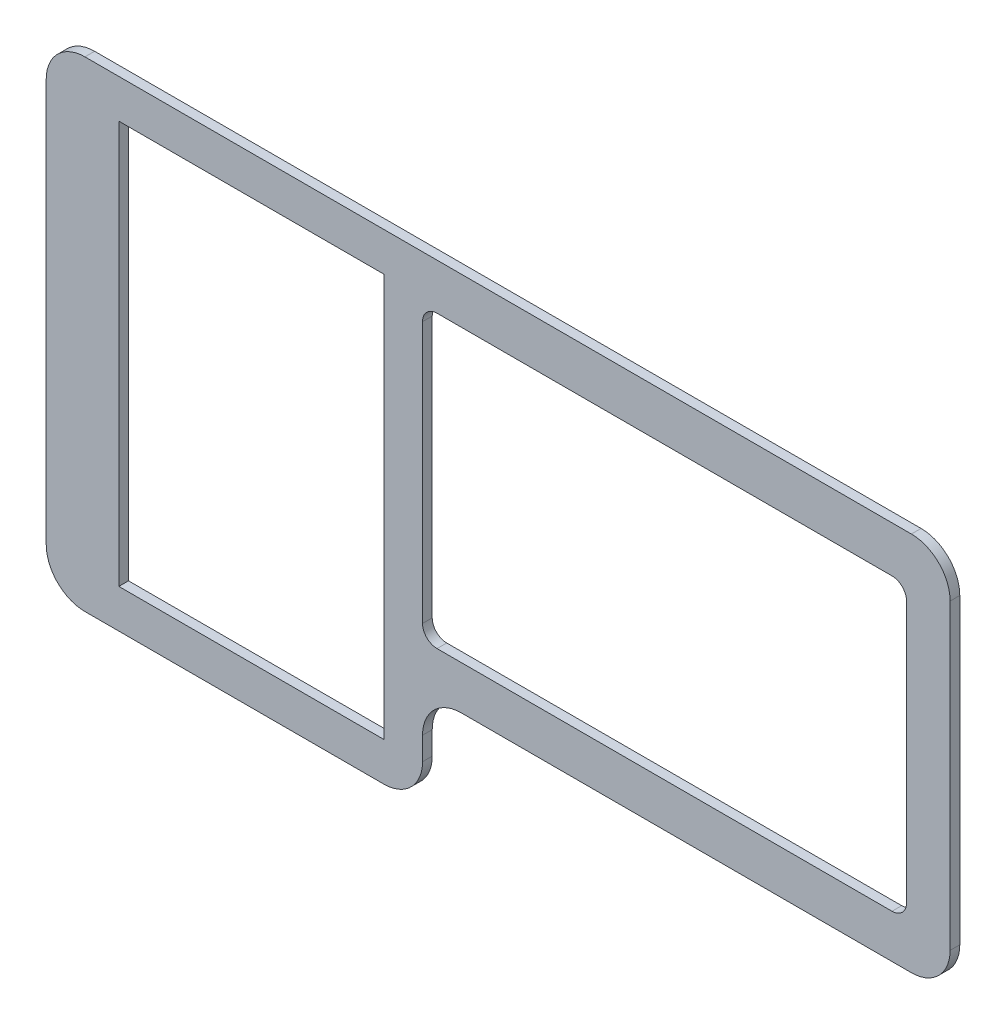
ISO-10303-21;
HEADER;
FILE_DESCRIPTION(('STEP AP214'),'2;1');
FILE_NAME('part.step','',(''),(''),'','','');
FILE_SCHEMA(('AUTOMOTIVE_DESIGN { 1 0 10303 214 1 1 1 1 }'));
ENDSEC;
DATA;
#1=APPLICATION_CONTEXT('core data for automotive mechanical design processes');
#2=APPLICATION_PROTOCOL_DEFINITION('international standard','automotive_design',2000,#1);
#3=PRODUCT_CONTEXT('',#1,'mechanical');
#4=PRODUCT('Part','Part','',(#3));
#5=PRODUCT_RELATED_PRODUCT_CATEGORY('part','',(#4));
#6=PRODUCT_DEFINITION_FORMATION('','',#4);
#7=PRODUCT_DEFINITION_CONTEXT('part definition',#1,'design');
#8=PRODUCT_DEFINITION('design','',#6,#7);
#9=PRODUCT_DEFINITION_SHAPE('','',#8);
#10=(LENGTH_UNIT() NAMED_UNIT(*) SI_UNIT(.MILLI.,.METRE.));
#11=(NAMED_UNIT(*) PLANE_ANGLE_UNIT() SI_UNIT($,.RADIAN.));
#12=(NAMED_UNIT(*) SI_UNIT($,.STERADIAN.) SOLID_ANGLE_UNIT());
#13=UNCERTAINTY_MEASURE_WITH_UNIT(LENGTH_MEASURE(1.E-05),#10,'distance_accuracy_value','');
#14=(GEOMETRIC_REPRESENTATION_CONTEXT(3) GLOBAL_UNCERTAINTY_ASSIGNED_CONTEXT((#13)) GLOBAL_UNIT_ASSIGNED_CONTEXT((#10,
#11,#12)) REPRESENTATION_CONTEXT('',''));
#15=CARTESIAN_POINT('',(0.,0.,0.));
#16=DIRECTION('',(0.,0.,1.));
#17=DIRECTION('',(1.,0.,0.));
#18=AXIS2_PLACEMENT_3D('',#15,#16,#17);
#19=CARTESIAN_POINT('',(51.,-31.,2.));
#20=DIRECTION('',(0.,0.,1.));
#21=DIRECTION('',(1.,0.,0.));
#22=AXIS2_PLACEMENT_3D('',#19,#20,#21);
#23=PLANE('',#22);
#24=CARTESIAN_POINT('',(51.,-31.,2.));
#25=DIRECTION('',(0.,0.,1.));
#26=DIRECTION('',(1.,0.,0.));
#27=AXIS2_PLACEMENT_3D('',#24,#25,#26);
#28=CIRCLE('',#27,8.);
#29=CARTESIAN_POINT('',(51.,-39.,2.));
#30=VERTEX_POINT('',#29);
#31=CARTESIAN_POINT('',(59.,-30.9999999999999,2.));
#32=VERTEX_POINT('',#31);
#33=EDGE_CURVE('E333',#30,#32,#28,.T.);
#34=ORIENTED_EDGE('',*,*,#33,.T.);
#35=DIRECTION('',(0.,1.,0.));
#36=VECTOR('',#35,1.);
#37=CARTESIAN_POINT('',(59.,31.5,2.));
#38=LINE('',#37,#36);
#39=CARTESIAN_POINT('',(59.,31.5,2.));
#40=VERTEX_POINT('',#39);
#41=EDGE_CURVE('E337',#32,#40,#38,.T.);
#42=ORIENTED_EDGE('',*,*,#41,.T.);
#43=CARTESIAN_POINT('',(51.,31.5,2.));
#44=DIRECTION('',(0.,0.,1.));
#45=DIRECTION('',(-1.,0.,0.));
#46=AXIS2_PLACEMENT_3D('',#43,#44,#45);
#47=CIRCLE('',#46,7.99999999999999);
#48=CARTESIAN_POINT('',(51.,39.5,2.));
#49=VERTEX_POINT('',#48);
#50=EDGE_CURVE('E341',#40,#49,#47,.T.);
#51=ORIENTED_EDGE('',*,*,#50,.T.);
#52=DIRECTION('',(-1.,0.,0.));
#53=VECTOR('',#52,1.);
#54=CARTESIAN_POINT('',(-119.75,39.5,2.));
#55=LINE('',#54,#53);
#56=CARTESIAN_POINT('',(-119.75,39.5,2.));
#57=VERTEX_POINT('',#56);
#58=EDGE_CURVE('E344',#49,#57,#55,.T.);
#59=ORIENTED_EDGE('',*,*,#58,.T.);
#60=CARTESIAN_POINT('',(-119.75,31.5,2.));
#61=DIRECTION('',(0.,0.,1.));
#62=DIRECTION('',(1.,0.,0.));
#63=AXIS2_PLACEMENT_3D('',#60,#61,#62);
#64=CIRCLE('',#63,8.);
#65=CARTESIAN_POINT('',(-127.75,31.5,2.));
#66=VERTEX_POINT('',#65);
#67=EDGE_CURVE('E347',#57,#66,#64,.T.);
#68=ORIENTED_EDGE('',*,*,#67,.T.);
#69=DIRECTION('',(0.,-1.,0.));
#70=VECTOR('',#69,1.);
#71=CARTESIAN_POINT('',(-127.75,31.5,2.));
#72=LINE('',#71,#70);
#73=CARTESIAN_POINT('',(-127.75,-51.75,2.));
#74=VERTEX_POINT('',#73);
#75=EDGE_CURVE('E350',#66,#74,#72,.T.);
#76=ORIENTED_EDGE('',*,*,#75,.T.);
#77=CARTESIAN_POINT('',(-119.75,-51.75,2.));
#78=DIRECTION('',(0.,0.,1.));
#79=DIRECTION('',(1.,0.,0.));
#80=AXIS2_PLACEMENT_3D('',#77,#78,#79);
#81=CIRCLE('',#80,8.00000000000001);
#82=CARTESIAN_POINT('',(-119.75,-59.75,2.));
#83=VERTEX_POINT('',#82);
#84=EDGE_CURVE('E353',#74,#83,#81,.T.);
#85=ORIENTED_EDGE('',*,*,#84,.T.);
#86=DIRECTION('',(1.,0.,0.));
#87=VECTOR('',#86,1.);
#88=CARTESIAN_POINT('',(-119.75,-59.75,2.));
#89=LINE('',#88,#87);
#90=CARTESIAN_POINT('',(-58.,-59.75,2.));
#91=VERTEX_POINT('',#90);
#92=EDGE_CURVE('E356',#83,#91,#89,.T.);
#93=ORIENTED_EDGE('',*,*,#92,.T.);
#94=CARTESIAN_POINT('',(-58.,-51.75,2.));
#95=DIRECTION('',(0.,0.,1.));
#96=DIRECTION('',(-1.,0.,0.));
#97=AXIS2_PLACEMENT_3D('',#94,#95,#96);
#98=CIRCLE('',#97,8.);
#99=CARTESIAN_POINT('',(-50.,-51.75,2.));
#100=VERTEX_POINT('',#99);
#101=EDGE_CURVE('E359',#91,#100,#98,.T.);
#102=ORIENTED_EDGE('',*,*,#101,.T.);
#103=DIRECTION('',(0.,1.,0.));
#104=VECTOR('',#103,1.);
#105=CARTESIAN_POINT('',(-50.,-51.75,2.));
#106=LINE('',#105,#104);
#107=CARTESIAN_POINT('',(-50.,-47.0000000000001,2.));
#108=VERTEX_POINT('',#107);
#109=EDGE_CURVE('E362',#100,#108,#106,.T.);
#110=ORIENTED_EDGE('',*,*,#109,.T.);
#111=CARTESIAN_POINT('',(-42.,-47.,2.));
#112=DIRECTION('',(0.,0.,-1.));
#113=DIRECTION('',(-1.,0.,0.));
#114=AXIS2_PLACEMENT_3D('',#111,#112,#113);
#115=CIRCLE('',#114,8.);
#116=CARTESIAN_POINT('',(-41.9999999999999,-39.,2.));
#117=VERTEX_POINT('',#116);
#118=EDGE_CURVE('E365',#108,#117,#115,.T.);
#119=ORIENTED_EDGE('',*,*,#118,.T.);
#120=DIRECTION('',(1.,0.,0.));
#121=VECTOR('',#120,1.);
#122=CARTESIAN_POINT('',(-41.9999999999999,-39.,2.));
#123=LINE('',#122,#121);
#124=EDGE_CURVE('E368',#117,#30,#123,.T.);
#125=ORIENTED_EDGE('',*,*,#124,.T.);
#126=EDGE_LOOP('',(#34,#42,#51,#59,#68,#76,#85,#93,#102,#110,#119,#125));
#127=FACE_BOUND('',#126,.T.);
#128=DIRECTION('',(1.,0.,0.));
#129=VECTOR('',#128,1.);
#130=CARTESIAN_POINT('',(-112.75,-51.75,2.));
#131=LINE('',#130,#129);
#132=CARTESIAN_POINT('',(-112.75,-51.75,2.));
#133=VERTEX_POINT('',#132);
#134=CARTESIAN_POINT('',(-58.,-51.75,2.));
#135=VERTEX_POINT('',#134);
#136=EDGE_CURVE('E293',#133,#135,#131,.T.);
#137=ORIENTED_EDGE('',*,*,#136,.F.);
#138=DIRECTION('',(0.,-1.,0.));
#139=VECTOR('',#138,1.);
#140=CARTESIAN_POINT('',(-112.75,31.5,2.));
#141=LINE('',#140,#139);
#142=CARTESIAN_POINT('',(-112.75,31.5,2.));
#143=VERTEX_POINT('',#142);
#144=EDGE_CURVE('E290',#143,#133,#141,.T.);
#145=ORIENTED_EDGE('',*,*,#144,.F.);
#146=DIRECTION('',(-1.,0.,0.));
#147=VECTOR('',#146,1.);
#148=CARTESIAN_POINT('',(-112.75,31.5,2.));
#149=LINE('',#148,#147);
#150=CARTESIAN_POINT('',(-58.,31.5,2.));
#151=VERTEX_POINT('',#150);
#152=EDGE_CURVE('E301',#151,#143,#149,.T.);
#153=ORIENTED_EDGE('',*,*,#152,.F.);
#154=DIRECTION('',(0.,1.,0.));
#155=VECTOR('',#154,1.);
#156=CARTESIAN_POINT('',(-58.,31.5,2.));
#157=LINE('',#156,#155);
#158=EDGE_CURVE('E297',#135,#151,#157,.T.);
#159=ORIENTED_EDGE('',*,*,#158,.F.);
#160=EDGE_LOOP('',(#137,#145,#153,#159));
#161=FACE_BOUND('',#160,.T.);
#162=DIRECTION('',(-1.,0.,0.));
#163=VECTOR('',#162,1.);
#164=CARTESIAN_POINT('',(-47.,30.,2.));
#165=LINE('',#164,#163);
#166=CARTESIAN_POINT('',(47.,30.,2.));
#167=VERTEX_POINT('',#166);
#168=CARTESIAN_POINT('',(-47.,30.,2.));
#169=VERTEX_POINT('',#168);
#170=EDGE_CURVE('E210',#167,#169,#165,.T.);
#171=ORIENTED_EDGE('',*,*,#170,.F.);
#172=CARTESIAN_POINT('',(47.,27.,2.));
#173=DIRECTION('',(0.,0.,1.));
#174=DIRECTION('',(-1.,0.,0.));
#175=AXIS2_PLACEMENT_3D('',#172,#173,#174);
#176=CIRCLE('',#175,3.);
#177=CARTESIAN_POINT('',(50.,27.,2.));
#178=VERTEX_POINT('',#177);
#179=EDGE_CURVE('E201',#178,#167,#176,.T.);
#180=ORIENTED_EDGE('',*,*,#179,.F.);
#181=DIRECTION('',(0.,1.,0.));
#182=VECTOR('',#181,1.);
#183=CARTESIAN_POINT('',(50.,27.,2.));
#184=LINE('',#183,#182);
#185=CARTESIAN_POINT('',(50.,-27.,2.));
#186=VERTEX_POINT('',#185);
#187=EDGE_CURVE('E242',#186,#178,#184,.T.);
#188=ORIENTED_EDGE('',*,*,#187,.F.);
#189=CARTESIAN_POINT('',(47.,-27.,2.));
#190=DIRECTION('',(0.,0.,1.));
#191=DIRECTION('',(1.,0.,0.));
#192=AXIS2_PLACEMENT_3D('',#189,#190,#191);
#193=CIRCLE('',#192,3.);
#194=CARTESIAN_POINT('',(47.,-30.,2.));
#195=VERTEX_POINT('',#194);
#196=EDGE_CURVE('E239',#195,#186,#193,.T.);
#197=ORIENTED_EDGE('',*,*,#196,.F.);
#198=DIRECTION('',(1.,0.,0.));
#199=VECTOR('',#198,1.);
#200=CARTESIAN_POINT('',(-47.,-30.,2.));
#201=LINE('',#200,#199);
#202=CARTESIAN_POINT('',(-47.,-30.,2.));
#203=VERTEX_POINT('',#202);
#204=EDGE_CURVE('E236',#203,#195,#201,.T.);
#205=ORIENTED_EDGE('',*,*,#204,.F.);
#206=CARTESIAN_POINT('',(-47.,-27.,2.));
#207=DIRECTION('',(0.,0.,1.));
#208=DIRECTION('',(1.,0.,0.));
#209=AXIS2_PLACEMENT_3D('',#206,#207,#208);
#210=CIRCLE('',#209,3.);
#211=CARTESIAN_POINT('',(-50.,-27.,2.));
#212=VERTEX_POINT('',#211);
#213=EDGE_CURVE('E233',#212,#203,#210,.T.);
#214=ORIENTED_EDGE('',*,*,#213,.F.);
#215=DIRECTION('',(0.,-1.,0.));
#216=VECTOR('',#215,1.);
#217=CARTESIAN_POINT('',(-50.,27.,2.));
#218=LINE('',#217,#216);
#219=CARTESIAN_POINT('',(-50.,27.,2.));
#220=VERTEX_POINT('',#219);
#221=EDGE_CURVE('E228',#220,#212,#218,.T.);
#222=ORIENTED_EDGE('',*,*,#221,.F.);
#223=CARTESIAN_POINT('',(-47.,27.,2.));
#224=DIRECTION('',(0.,0.,1.));
#225=DIRECTION('',(1.,0.,0.));
#226=AXIS2_PLACEMENT_3D('',#223,#224,#225);
#227=CIRCLE('',#226,3.);
#228=EDGE_CURVE('E224',#169,#220,#227,.T.);
#229=ORIENTED_EDGE('',*,*,#228,.F.);
#230=EDGE_LOOP('',(#171,#180,#188,#197,#205,#214,#222,#229));
#231=FACE_BOUND('',#230,.T.);
#232=ADVANCED_FACE('F39',(#127,#161,#231),#23,.T.);
#233=CARTESIAN_POINT('',(51.,-31.,0.));
#234=DIRECTION('',(0.,0.,1.));
#235=DIRECTION('',(1.,0.,0.));
#236=AXIS2_PLACEMENT_3D('',#233,#234,#235);
#237=PLANE('',#236);
#238=DIRECTION('',(0.,-1.,0.));
#239=VECTOR('',#238,1.);
#240=CARTESIAN_POINT('',(-112.75,31.5,0.));
#241=LINE('',#240,#239);
#242=CARTESIAN_POINT('',(-112.75,31.5,0.));
#243=VERTEX_POINT('',#242);
#244=CARTESIAN_POINT('',(-112.75,-51.75,0.));
#245=VERTEX_POINT('',#244);
#246=EDGE_CURVE('E219',#243,#245,#241,.T.);
#247=ORIENTED_EDGE('',*,*,#246,.T.);
#248=DIRECTION('',(1.,0.,0.));
#249=VECTOR('',#248,1.);
#250=CARTESIAN_POINT('',(-112.75,-51.75,0.));
#251=LINE('',#250,#249);
#252=CARTESIAN_POINT('',(-58.,-51.75,0.));
#253=VERTEX_POINT('',#252);
#254=EDGE_CURVE('E308',#245,#253,#251,.T.);
#255=ORIENTED_EDGE('',*,*,#254,.T.);
#256=DIRECTION('',(0.,1.,0.));
#257=VECTOR('',#256,1.);
#258=CARTESIAN_POINT('',(-58.,31.5,0.));
#259=LINE('',#258,#257);
#260=CARTESIAN_POINT('',(-58.,31.5,0.));
#261=VERTEX_POINT('',#260);
#262=EDGE_CURVE('E312',#253,#261,#259,.T.);
#263=ORIENTED_EDGE('',*,*,#262,.T.);
#264=DIRECTION('',(-1.,0.,0.));
#265=VECTOR('',#264,1.);
#266=CARTESIAN_POINT('',(-112.75,31.5,0.));
#267=LINE('',#266,#265);
#268=EDGE_CURVE('E294',#261,#243,#267,.T.);
#269=ORIENTED_EDGE('',*,*,#268,.T.);
#270=EDGE_LOOP('',(#247,#255,#263,#269));
#271=FACE_BOUND('',#270,.T.);
#272=CARTESIAN_POINT('',(51.,-31.,0.));
#273=DIRECTION('',(0.,0.,1.));
#274=DIRECTION('',(1.,0.,0.));
#275=AXIS2_PLACEMENT_3D('',#272,#273,#274);
#276=CIRCLE('',#275,8.);
#277=CARTESIAN_POINT('',(51.,-39.,0.));
#278=VERTEX_POINT('',#277);
#279=CARTESIAN_POINT('',(59.,-30.9999999999999,0.));
#280=VERTEX_POINT('',#279);
#281=EDGE_CURVE('E332',#278,#280,#276,.T.);
#282=ORIENTED_EDGE('',*,*,#281,.F.);
#283=DIRECTION('',(1.,0.,0.));
#284=VECTOR('',#283,1.);
#285=CARTESIAN_POINT('',(-41.9999999999999,-39.,0.));
#286=LINE('',#285,#284);
#287=CARTESIAN_POINT('',(-41.9999999999999,-39.,0.));
#288=VERTEX_POINT('',#287);
#289=EDGE_CURVE('E338',#288,#278,#286,.T.);
#290=ORIENTED_EDGE('',*,*,#289,.F.);
#291=CARTESIAN_POINT('',(-42.,-47.,0.));
#292=DIRECTION('',(0.,0.,-1.));
#293=DIRECTION('',(-1.,0.,0.));
#294=AXIS2_PLACEMENT_3D('',#291,#292,#293);
#295=CIRCLE('',#294,8.);
#296=CARTESIAN_POINT('',(-50.,-47.0000000000001,0.));
#297=VERTEX_POINT('',#296);
#298=EDGE_CURVE('E402',#297,#288,#295,.T.);
#299=ORIENTED_EDGE('',*,*,#298,.F.);
#300=DIRECTION('',(0.,1.,0.));
#301=VECTOR('',#300,1.);
#302=CARTESIAN_POINT('',(-50.,-51.75,0.));
#303=LINE('',#302,#301);
#304=CARTESIAN_POINT('',(-50.,-51.75,0.));
#305=VERTEX_POINT('',#304);
#306=EDGE_CURVE('E399',#305,#297,#303,.T.);
#307=ORIENTED_EDGE('',*,*,#306,.F.);
#308=CARTESIAN_POINT('',(-58.,-51.75,0.));
#309=DIRECTION('',(0.,0.,1.));
#310=DIRECTION('',(-1.,0.,0.));
#311=AXIS2_PLACEMENT_3D('',#308,#309,#310);
#312=CIRCLE('',#311,8.);
#313=CARTESIAN_POINT('',(-58.,-59.75,0.));
#314=VERTEX_POINT('',#313);
#315=EDGE_CURVE('E396',#314,#305,#312,.T.);
#316=ORIENTED_EDGE('',*,*,#315,.F.);
#317=DIRECTION('',(1.,0.,0.));
#318=VECTOR('',#317,1.);
#319=CARTESIAN_POINT('',(-119.75,-59.75,0.));
#320=LINE('',#319,#318);
#321=CARTESIAN_POINT('',(-119.75,-59.75,0.));
#322=VERTEX_POINT('',#321);
#323=EDGE_CURVE('E393',#322,#314,#320,.T.);
#324=ORIENTED_EDGE('',*,*,#323,.F.);
#325=CARTESIAN_POINT('',(-119.75,-51.75,0.));
#326=DIRECTION('',(0.,0.,1.));
#327=DIRECTION('',(1.,0.,0.));
#328=AXIS2_PLACEMENT_3D('',#325,#326,#327);
#329=CIRCLE('',#328,8.00000000000001);
#330=CARTESIAN_POINT('',(-127.75,-51.75,0.));
#331=VERTEX_POINT('',#330);
#332=EDGE_CURVE('E390',#331,#322,#329,.T.);
#333=ORIENTED_EDGE('',*,*,#332,.F.);
#334=DIRECTION('',(0.,-1.,0.));
#335=VECTOR('',#334,1.);
#336=CARTESIAN_POINT('',(-127.75,31.5,0.));
#337=LINE('',#336,#335);
#338=CARTESIAN_POINT('',(-127.75,31.5,0.));
#339=VERTEX_POINT('',#338);
#340=EDGE_CURVE('E387',#339,#331,#337,.T.);
#341=ORIENTED_EDGE('',*,*,#340,.F.);
#342=CARTESIAN_POINT('',(-119.75,31.5,0.));
#343=DIRECTION('',(0.,0.,1.));
#344=DIRECTION('',(1.,0.,0.));
#345=AXIS2_PLACEMENT_3D('',#342,#343,#344);
#346=CIRCLE('',#345,8.);
#347=CARTESIAN_POINT('',(-119.75,39.5,0.));
#348=VERTEX_POINT('',#347);
#349=EDGE_CURVE('E384',#348,#339,#346,.T.);
#350=ORIENTED_EDGE('',*,*,#349,.F.);
#351=DIRECTION('',(-1.,0.,0.));
#352=VECTOR('',#351,1.);
#353=CARTESIAN_POINT('',(-119.75,39.5,0.));
#354=LINE('',#353,#352);
#355=CARTESIAN_POINT('',(51.,39.5,0.));
#356=VERTEX_POINT('',#355);
#357=EDGE_CURVE('E381',#356,#348,#354,.T.);
#358=ORIENTED_EDGE('',*,*,#357,.F.);
#359=CARTESIAN_POINT('',(51.,31.5,0.));
#360=DIRECTION('',(0.,0.,1.));
#361=DIRECTION('',(-1.,0.,0.));
#362=AXIS2_PLACEMENT_3D('',#359,#360,#361);
#363=CIRCLE('',#362,7.99999999999999);
#364=CARTESIAN_POINT('',(59.,31.5,0.));
#365=VERTEX_POINT('',#364);
#366=EDGE_CURVE('E378',#365,#356,#363,.T.);
#367=ORIENTED_EDGE('',*,*,#366,.F.);
#368=DIRECTION('',(0.,1.,0.));
#369=VECTOR('',#368,1.);
#370=CARTESIAN_POINT('',(59.,31.5,0.));
#371=LINE('',#370,#369);
#372=EDGE_CURVE('E375',#280,#365,#371,.T.);
#373=ORIENTED_EDGE('',*,*,#372,.F.);
#374=EDGE_LOOP('',(#282,#290,#299,#307,#316,#324,#333,#341,#350,#358,#367,#373));
#375=FACE_BOUND('',#374,.T.);
#376=CARTESIAN_POINT('',(47.,27.,0.));
#377=DIRECTION('',(0.,0.,1.));
#378=DIRECTION('',(-1.,0.,0.));
#379=AXIS2_PLACEMENT_3D('',#376,#377,#378);
#380=CIRCLE('',#379,3.);
#381=CARTESIAN_POINT('',(50.,27.,0.));
#382=VERTEX_POINT('',#381);
#383=CARTESIAN_POINT('',(47.,30.,0.));
#384=VERTEX_POINT('',#383);
#385=EDGE_CURVE('E63',#382,#384,#380,.T.);
#386=ORIENTED_EDGE('',*,*,#385,.T.);
#387=DIRECTION('',(-1.,0.,0.));
#388=VECTOR('',#387,1.);
#389=CARTESIAN_POINT('',(-47.,30.,0.));
#390=LINE('',#389,#388);
#391=CARTESIAN_POINT('',(-47.,30.,0.));
#392=VERTEX_POINT('',#391);
#393=EDGE_CURVE('E217',#384,#392,#390,.T.);
#394=ORIENTED_EDGE('',*,*,#393,.T.);
#395=CARTESIAN_POINT('',(-47.,27.,0.));
#396=DIRECTION('',(0.,0.,1.));
#397=DIRECTION('',(1.,0.,0.));
#398=AXIS2_PLACEMENT_3D('',#395,#396,#397);
#399=CIRCLE('',#398,3.);
#400=CARTESIAN_POINT('',(-50.,27.,0.));
#401=VERTEX_POINT('',#400);
#402=EDGE_CURVE('E249',#392,#401,#399,.T.);
#403=ORIENTED_EDGE('',*,*,#402,.T.);
#404=DIRECTION('',(0.,-1.,0.));
#405=VECTOR('',#404,1.);
#406=CARTESIAN_POINT('',(-50.,27.,0.));
#407=LINE('',#406,#405);
#408=CARTESIAN_POINT('',(-50.,-27.,0.));
#409=VERTEX_POINT('',#408);
#410=EDGE_CURVE('E253',#401,#409,#407,.T.);
#411=ORIENTED_EDGE('',*,*,#410,.T.);
#412=CARTESIAN_POINT('',(-47.,-27.,0.));
#413=DIRECTION('',(0.,0.,1.));
#414=DIRECTION('',(1.,0.,0.));
#415=AXIS2_PLACEMENT_3D('',#412,#413,#414);
#416=CIRCLE('',#415,3.);
#417=CARTESIAN_POINT('',(-47.,-30.,0.));
#418=VERTEX_POINT('',#417);
#419=EDGE_CURVE('E257',#409,#418,#416,.T.);
#420=ORIENTED_EDGE('',*,*,#419,.T.);
#421=DIRECTION('',(1.,0.,0.));
#422=VECTOR('',#421,1.);
#423=CARTESIAN_POINT('',(-47.,-30.,0.));
#424=LINE('',#423,#422);
#425=CARTESIAN_POINT('',(47.,-30.,0.));
#426=VERTEX_POINT('',#425);
#427=EDGE_CURVE('E261',#418,#426,#424,.T.);
#428=ORIENTED_EDGE('',*,*,#427,.T.);
#429=CARTESIAN_POINT('',(47.,-27.,0.));
#430=DIRECTION('',(0.,0.,1.));
#431=DIRECTION('',(1.,0.,0.));
#432=AXIS2_PLACEMENT_3D('',#429,#430,#431);
#433=CIRCLE('',#432,3.);
#434=CARTESIAN_POINT('',(50.,-27.,0.));
#435=VERTEX_POINT('',#434);
#436=EDGE_CURVE('E265',#426,#435,#433,.T.);
#437=ORIENTED_EDGE('',*,*,#436,.T.);
#438=DIRECTION('',(0.,1.,0.));
#439=VECTOR('',#438,1.);
#440=CARTESIAN_POINT('',(50.,27.,0.));
#441=LINE('',#440,#439);
#442=EDGE_CURVE('E211',#435,#382,#441,.T.);
#443=ORIENTED_EDGE('',*,*,#442,.T.);
#444=EDGE_LOOP('',(#386,#394,#403,#411,#420,#428,#437,#443));
#445=FACE_BOUND('',#444,.T.);
#446=ADVANCED_FACE('F457',(#271,#375,#445),#237,.F.);
#447=CARTESIAN_POINT('',(51.,-31.,2.));
#448=DIRECTION('',(0.,0.,-1.));
#449=DIRECTION('',(-1.,0.,0.));
#450=AXIS2_PLACEMENT_3D('',#447,#448,#449);
#451=CYLINDRICAL_SURFACE('',#450,8.);
#452=ORIENTED_EDGE('',*,*,#281,.T.);
#453=DIRECTION('',(0.,0.,-1.));
#454=VECTOR('',#453,1.);
#455=CARTESIAN_POINT('',(59.,-30.9999999999999,2.));
#456=LINE('',#455,#454);
#457=EDGE_CURVE('E11',#32,#280,#456,.T.);
#458=ORIENTED_EDGE('',*,*,#457,.F.);
#459=ORIENTED_EDGE('',*,*,#33,.F.);
#460=DIRECTION('',(0.,0.,-1.));
#461=VECTOR('',#460,1.);
#462=CARTESIAN_POINT('',(51.,-39.,2.));
#463=LINE('',#462,#461);
#464=EDGE_CURVE('E371',#30,#278,#463,.T.);
#465=ORIENTED_EDGE('',*,*,#464,.T.);
#466=EDGE_LOOP('',(#452,#458,#459,#465));
#467=FACE_BOUND('',#466,.T.);
#468=ADVANCED_FACE('F41',(#467),#451,.T.);
#469=CARTESIAN_POINT('',(59.,31.5,2.));
#470=DIRECTION('',(-1.,0.,0.));
#471=DIRECTION('',(0.,-1.,0.));
#472=AXIS2_PLACEMENT_3D('',#469,#470,#471);
#473=PLANE('',#472);
#474=ORIENTED_EDGE('',*,*,#372,.T.);
#475=DIRECTION('',(0.,0.,-1.));
#476=VECTOR('',#475,1.);
#477=CARTESIAN_POINT('',(59.,31.5,2.));
#478=LINE('',#477,#476);
#479=EDGE_CURVE('E48',#40,#365,#478,.T.);
#480=ORIENTED_EDGE('',*,*,#479,.F.);
#481=ORIENTED_EDGE('',*,*,#41,.F.);
#482=ORIENTED_EDGE('',*,*,#457,.T.);
#483=EDGE_LOOP('',(#474,#480,#481,#482));
#484=FACE_BOUND('',#483,.T.);
#485=ADVANCED_FACE('F475',(#484),#473,.F.);
#486=CARTESIAN_POINT('',(51.,31.5,2.));
#487=DIRECTION('',(0.,0.,-1.));
#488=DIRECTION('',(-1.,0.,0.));
#489=AXIS2_PLACEMENT_3D('',#486,#487,#488);
#490=CYLINDRICAL_SURFACE('',#489,7.99999999999999);
#491=ORIENTED_EDGE('',*,*,#366,.T.);
#492=DIRECTION('',(0.,0.,-1.));
#493=VECTOR('',#492,1.);
#494=CARTESIAN_POINT('',(51.,39.5,2.));
#495=LINE('',#494,#493);
#496=EDGE_CURVE('E442',#49,#356,#495,.T.);
#497=ORIENTED_EDGE('',*,*,#496,.F.);
#498=ORIENTED_EDGE('',*,*,#50,.F.);
#499=ORIENTED_EDGE('',*,*,#479,.T.);
#500=EDGE_LOOP('',(#491,#497,#498,#499));
#501=FACE_BOUND('',#500,.T.);
#502=ADVANCED_FACE('F451',(#501),#490,.T.);
#503=CARTESIAN_POINT('',(-119.75,39.5,2.));
#504=DIRECTION('',(0.,-1.,0.));
#505=DIRECTION('',(1.,0.,0.));
#506=AXIS2_PLACEMENT_3D('',#503,#504,#505);
#507=PLANE('',#506);
#508=ORIENTED_EDGE('',*,*,#357,.T.);
#509=DIRECTION('',(0.,0.,-1.));
#510=VECTOR('',#509,1.);
#511=CARTESIAN_POINT('',(-119.75,39.5,2.));
#512=LINE('',#511,#510);
#513=EDGE_CURVE('E438',#57,#348,#512,.T.);
#514=ORIENTED_EDGE('',*,*,#513,.F.);
#515=ORIENTED_EDGE('',*,*,#58,.F.);
#516=ORIENTED_EDGE('',*,*,#496,.T.);
#517=EDGE_LOOP('',(#508,#514,#515,#516));
#518=FACE_BOUND('',#517,.T.);
#519=ADVANCED_FACE('F463',(#518),#507,.F.);
#520=CARTESIAN_POINT('',(-119.75,31.5,2.));
#521=DIRECTION('',(0.,0.,-1.));
#522=DIRECTION('',(-1.,0.,0.));
#523=AXIS2_PLACEMENT_3D('',#520,#521,#522);
#524=CYLINDRICAL_SURFACE('',#523,8.);
#525=ORIENTED_EDGE('',*,*,#349,.T.);
#526=DIRECTION('',(0.,0.,-1.));
#527=VECTOR('',#526,1.);
#528=CARTESIAN_POINT('',(-127.75,31.5,2.));
#529=LINE('',#528,#527);
#530=EDGE_CURVE('E434',#66,#339,#529,.T.);
#531=ORIENTED_EDGE('',*,*,#530,.F.);
#532=ORIENTED_EDGE('',*,*,#67,.F.);
#533=ORIENTED_EDGE('',*,*,#513,.T.);
#534=EDGE_LOOP('',(#525,#531,#532,#533));
#535=FACE_BOUND('',#534,.T.);
#536=ADVANCED_FACE('F467',(#535),#524,.T.);
#537=CARTESIAN_POINT('',(-127.75,31.5,2.));
#538=DIRECTION('',(1.,0.,0.));
#539=DIRECTION('',(0.,0.,-1.));
#540=AXIS2_PLACEMENT_3D('',#537,#538,#539);
#541=PLANE('',#540);
#542=ORIENTED_EDGE('',*,*,#340,.T.);
#543=DIRECTION('',(0.,0.,-1.));
#544=VECTOR('',#543,1.);
#545=CARTESIAN_POINT('',(-127.75,-51.75,2.));
#546=LINE('',#545,#544);
#547=EDGE_CURVE('E430',#74,#331,#546,.T.);
#548=ORIENTED_EDGE('',*,*,#547,.F.);
#549=ORIENTED_EDGE('',*,*,#75,.F.);
#550=ORIENTED_EDGE('',*,*,#530,.T.);
#551=EDGE_LOOP('',(#542,#548,#549,#550));
#552=FACE_BOUND('',#551,.T.);
#553=ADVANCED_FACE('F508',(#552),#541,.F.);
#554=CARTESIAN_POINT('',(-119.75,-51.75,2.));
#555=DIRECTION('',(0.,0.,-1.));
#556=DIRECTION('',(-1.,0.,0.));
#557=AXIS2_PLACEMENT_3D('',#554,#555,#556);
#558=CYLINDRICAL_SURFACE('',#557,8.00000000000001);
#559=ORIENTED_EDGE('',*,*,#332,.T.);
#560=DIRECTION('',(0.,0.,-1.));
#561=VECTOR('',#560,1.);
#562=CARTESIAN_POINT('',(-119.75,-59.75,2.));
#563=LINE('',#562,#561);
#564=EDGE_CURVE('E426',#83,#322,#563,.T.);
#565=ORIENTED_EDGE('',*,*,#564,.F.);
#566=ORIENTED_EDGE('',*,*,#84,.F.);
#567=ORIENTED_EDGE('',*,*,#547,.T.);
#568=EDGE_LOOP('',(#559,#565,#566,#567));
#569=FACE_BOUND('',#568,.T.);
#570=ADVANCED_FACE('F506',(#569),#558,.T.);
#571=CARTESIAN_POINT('',(-119.75,-59.75,2.));
#572=DIRECTION('',(0.,1.,0.));
#573=DIRECTION('',(0.,0.,1.));
#574=AXIS2_PLACEMENT_3D('',#571,#572,#573);
#575=PLANE('',#574);
#576=ORIENTED_EDGE('',*,*,#323,.T.);
#577=DIRECTION('',(0.,0.,-1.));
#578=VECTOR('',#577,1.);
#579=CARTESIAN_POINT('',(-58.,-59.75,2.));
#580=LINE('',#579,#578);
#581=EDGE_CURVE('E422',#91,#314,#580,.T.);
#582=ORIENTED_EDGE('',*,*,#581,.F.);
#583=ORIENTED_EDGE('',*,*,#92,.F.);
#584=ORIENTED_EDGE('',*,*,#564,.T.);
#585=EDGE_LOOP('',(#576,#582,#583,#584));
#586=FACE_BOUND('',#585,.T.);
#587=ADVANCED_FACE('F502',(#586),#575,.F.);
#588=CARTESIAN_POINT('',(-58.,-51.75,2.));
#589=DIRECTION('',(0.,0.,-1.));
#590=DIRECTION('',(-1.,0.,0.));
#591=AXIS2_PLACEMENT_3D('',#588,#589,#590);
#592=CYLINDRICAL_SURFACE('',#591,8.);
#593=ORIENTED_EDGE('',*,*,#315,.T.);
#594=DIRECTION('',(0.,0.,-1.));
#595=VECTOR('',#594,1.);
#596=CARTESIAN_POINT('',(-50.,-51.75,2.));
#597=LINE('',#596,#595);
#598=EDGE_CURVE('E418',#100,#305,#597,.T.);
#599=ORIENTED_EDGE('',*,*,#598,.F.);
#600=ORIENTED_EDGE('',*,*,#101,.F.);
#601=ORIENTED_EDGE('',*,*,#581,.T.);
#602=EDGE_LOOP('',(#593,#599,#600,#601));
#603=FACE_BOUND('',#602,.T.);
#604=ADVANCED_FACE('F497',(#603),#592,.T.);
#605=CARTESIAN_POINT('',(-50.,-51.75,2.));
#606=DIRECTION('',(-1.,0.,0.));
#607=DIRECTION('',(0.,0.,1.));
#608=AXIS2_PLACEMENT_3D('',#605,#606,#607);
#609=PLANE('',#608);
#610=ORIENTED_EDGE('',*,*,#306,.T.);
#611=DIRECTION('',(0.,0.,-1.));
#612=VECTOR('',#611,1.);
#613=CARTESIAN_POINT('',(-50.,-47.0000000000001,2.));
#614=LINE('',#613,#612);
#615=EDGE_CURVE('E414',#108,#297,#614,.T.);
#616=ORIENTED_EDGE('',*,*,#615,.F.);
#617=ORIENTED_EDGE('',*,*,#109,.F.);
#618=ORIENTED_EDGE('',*,*,#598,.T.);
#619=EDGE_LOOP('',(#610,#616,#617,#618));
#620=FACE_BOUND('',#619,.T.);
#621=ADVANCED_FACE('F491',(#620),#609,.F.);
#622=CARTESIAN_POINT('',(-42.,-47.,2.));
#623=DIRECTION('',(0.,0.,-1.));
#624=DIRECTION('',(-1.,0.,0.));
#625=AXIS2_PLACEMENT_3D('',#622,#623,#624);
#626=CYLINDRICAL_SURFACE('',#625,8.);
#627=ORIENTED_EDGE('',*,*,#298,.T.);
#628=DIRECTION('',(0.,0.,-1.));
#629=VECTOR('',#628,1.);
#630=CARTESIAN_POINT('',(-41.9999999999999,-39.,2.));
#631=LINE('',#630,#629);
#632=EDGE_CURVE('E410',#117,#288,#631,.T.);
#633=ORIENTED_EDGE('',*,*,#632,.F.);
#634=ORIENTED_EDGE('',*,*,#118,.F.);
#635=ORIENTED_EDGE('',*,*,#615,.T.);
#636=EDGE_LOOP('',(#627,#633,#634,#635));
#637=FACE_BOUND('',#636,.T.);
#638=ADVANCED_FACE('F487',(#637),#626,.F.);
#639=CARTESIAN_POINT('',(-41.9999999999999,-39.,2.));
#640=DIRECTION('',(0.,1.,0.));
#641=DIRECTION('',(0.,0.,1.));
#642=AXIS2_PLACEMENT_3D('',#639,#640,#641);
#643=PLANE('',#642);
#644=ORIENTED_EDGE('',*,*,#289,.T.);
#645=ORIENTED_EDGE('',*,*,#464,.F.);
#646=ORIENTED_EDGE('',*,*,#124,.F.);
#647=ORIENTED_EDGE('',*,*,#632,.T.);
#648=EDGE_LOOP('',(#644,#645,#646,#647));
#649=FACE_BOUND('',#648,.T.);
#650=ADVANCED_FACE('F482',(#649),#643,.F.);
#651=CARTESIAN_POINT('',(-112.75,31.5,2.));
#652=DIRECTION('',(1.,0.,0.));
#653=DIRECTION('',(0.,1.,0.));
#654=AXIS2_PLACEMENT_3D('',#651,#652,#653);
#655=PLANE('',#654);
#656=ORIENTED_EDGE('',*,*,#246,.F.);
#657=DIRECTION('',(0.,0.,-1.));
#658=VECTOR('',#657,1.);
#659=CARTESIAN_POINT('',(-112.75,31.5,2.));
#660=LINE('',#659,#658);
#661=EDGE_CURVE('E304',#143,#243,#660,.T.);
#662=ORIENTED_EDGE('',*,*,#661,.F.);
#663=ORIENTED_EDGE('',*,*,#144,.T.);
#664=DIRECTION('',(0.,0.,-1.));
#665=VECTOR('',#664,1.);
#666=CARTESIAN_POINT('',(-112.75,-51.75,2.));
#667=LINE('',#666,#665);
#668=EDGE_CURVE('E328',#133,#245,#667,.T.);
#669=ORIENTED_EDGE('',*,*,#668,.T.);
#670=EDGE_LOOP('',(#656,#662,#663,#669));
#671=FACE_BOUND('',#670,.T.);
#672=ADVANCED_FACE('F525',(#671),#655,.T.);
#673=CARTESIAN_POINT('',(-112.75,-51.75,2.));
#674=DIRECTION('',(0.,1.,0.));
#675=DIRECTION('',(0.,0.,1.));
#676=AXIS2_PLACEMENT_3D('',#673,#674,#675);
#677=PLANE('',#676);
#678=ORIENTED_EDGE('',*,*,#254,.F.);
#679=ORIENTED_EDGE('',*,*,#668,.F.);
#680=ORIENTED_EDGE('',*,*,#136,.T.);
#681=DIRECTION('',(0.,0.,-1.));
#682=VECTOR('',#681,1.);
#683=CARTESIAN_POINT('',(-58.,-51.75,2.));
#684=LINE('',#683,#682);
#685=EDGE_CURVE('E325',#135,#253,#684,.T.);
#686=ORIENTED_EDGE('',*,*,#685,.T.);
#687=EDGE_LOOP('',(#678,#679,#680,#686));
#688=FACE_BOUND('',#687,.T.);
#689=ADVANCED_FACE('F563',(#688),#677,.T.);
#690=CARTESIAN_POINT('',(-58.,31.5,2.));
#691=DIRECTION('',(-1.,0.,0.));
#692=DIRECTION('',(0.,-1.,0.));
#693=AXIS2_PLACEMENT_3D('',#690,#691,#692);
#694=PLANE('',#693);
#695=ORIENTED_EDGE('',*,*,#262,.F.);
#696=ORIENTED_EDGE('',*,*,#685,.F.);
#697=ORIENTED_EDGE('',*,*,#158,.T.);
#698=DIRECTION('',(0.,0.,-1.));
#699=VECTOR('',#698,1.);
#700=CARTESIAN_POINT('',(-58.,31.5,2.));
#701=LINE('',#700,#699);
#702=EDGE_CURVE('E322',#151,#261,#701,.T.);
#703=ORIENTED_EDGE('',*,*,#702,.T.);
#704=EDGE_LOOP('',(#695,#696,#697,#703));
#705=FACE_BOUND('',#704,.T.);
#706=ADVANCED_FACE('F570',(#705),#694,.T.);
#707=CARTESIAN_POINT('',(-112.75,31.5,2.));
#708=DIRECTION('',(0.,-1.,0.));
#709=DIRECTION('',(1.,0.,0.));
#710=AXIS2_PLACEMENT_3D('',#707,#708,#709);
#711=PLANE('',#710);
#712=ORIENTED_EDGE('',*,*,#268,.F.);
#713=ORIENTED_EDGE('',*,*,#702,.F.);
#714=ORIENTED_EDGE('',*,*,#152,.T.);
#715=ORIENTED_EDGE('',*,*,#661,.T.);
#716=EDGE_LOOP('',(#712,#713,#714,#715));
#717=FACE_BOUND('',#716,.T.);
#718=ADVANCED_FACE('F577',(#717),#711,.T.);
#719=CARTESIAN_POINT('',(47.,27.,2.));
#720=DIRECTION('',(0.,0.,-1.));
#721=DIRECTION('',(-1.,0.,0.));
#722=AXIS2_PLACEMENT_3D('',#719,#720,#721);
#723=CYLINDRICAL_SURFACE('',#722,3.);
#724=ORIENTED_EDGE('',*,*,#385,.F.);
#725=DIRECTION('',(0.,0.,-1.));
#726=VECTOR('',#725,1.);
#727=CARTESIAN_POINT('',(50.,27.,2.));
#728=LINE('',#727,#726);
#729=EDGE_CURVE('E205',#178,#382,#728,.T.);
#730=ORIENTED_EDGE('',*,*,#729,.F.);
#731=ORIENTED_EDGE('',*,*,#179,.T.);
#732=DIRECTION('',(0.,0.,-1.));
#733=VECTOR('',#732,1.);
#734=CARTESIAN_POINT('',(47.,30.,2.));
#735=LINE('',#734,#733);
#736=EDGE_CURVE('E204',#167,#384,#735,.T.);
#737=ORIENTED_EDGE('',*,*,#736,.T.);
#738=EDGE_LOOP('',(#724,#730,#731,#737));
#739=FACE_BOUND('',#738,.T.);
#740=ADVANCED_FACE('F203',(#739),#723,.F.);
#741=CARTESIAN_POINT('',(-47.,30.,2.));
#742=DIRECTION('',(0.,-1.,0.));
#743=DIRECTION('',(0.,0.,-1.));
#744=AXIS2_PLACEMENT_3D('',#741,#742,#743);
#745=PLANE('',#744);
#746=ORIENTED_EDGE('',*,*,#393,.F.);
#747=ORIENTED_EDGE('',*,*,#736,.F.);
#748=ORIENTED_EDGE('',*,*,#170,.T.);
#749=DIRECTION('',(0.,0.,-1.));
#750=VECTOR('',#749,1.);
#751=CARTESIAN_POINT('',(-47.,30.,2.));
#752=LINE('',#751,#750);
#753=EDGE_CURVE('E220',#169,#392,#752,.T.);
#754=ORIENTED_EDGE('',*,*,#753,.T.);
#755=EDGE_LOOP('',(#746,#747,#748,#754));
#756=FACE_BOUND('',#755,.T.);
#757=ADVANCED_FACE('F214',(#756),#745,.T.);
#758=CARTESIAN_POINT('',(-47.,27.,2.));
#759=DIRECTION('',(0.,0.,-1.));
#760=DIRECTION('',(-1.,0.,0.));
#761=AXIS2_PLACEMENT_3D('',#758,#759,#760);
#762=CYLINDRICAL_SURFACE('',#761,3.);
#763=ORIENTED_EDGE('',*,*,#402,.F.);
#764=ORIENTED_EDGE('',*,*,#753,.F.);
#765=ORIENTED_EDGE('',*,*,#228,.T.);
#766=DIRECTION('',(0.,0.,-1.));
#767=VECTOR('',#766,1.);
#768=CARTESIAN_POINT('',(-50.,27.,2.));
#769=LINE('',#768,#767);
#770=EDGE_CURVE('E285',#220,#401,#769,.T.);
#771=ORIENTED_EDGE('',*,*,#770,.T.);
#772=EDGE_LOOP('',(#763,#764,#765,#771));
#773=FACE_BOUND('',#772,.T.);
#774=ADVANCED_FACE('F598',(#773),#762,.F.);
#775=CARTESIAN_POINT('',(-50.,27.,2.));
#776=DIRECTION('',(1.,0.,0.));
#777=DIRECTION('',(0.,1.,0.));
#778=AXIS2_PLACEMENT_3D('',#775,#776,#777);
#779=PLANE('',#778);
#780=ORIENTED_EDGE('',*,*,#410,.F.);
#781=ORIENTED_EDGE('',*,*,#770,.F.);
#782=ORIENTED_EDGE('',*,*,#221,.T.);
#783=DIRECTION('',(0.,0.,-1.));
#784=VECTOR('',#783,1.);
#785=CARTESIAN_POINT('',(-50.,-27.,2.));
#786=LINE('',#785,#784);
#787=EDGE_CURVE('E282',#212,#409,#786,.T.);
#788=ORIENTED_EDGE('',*,*,#787,.T.);
#789=EDGE_LOOP('',(#780,#781,#782,#788));
#790=FACE_BOUND('',#789,.T.);
#791=ADVANCED_FACE('F605',(#790),#779,.T.);
#792=CARTESIAN_POINT('',(-47.,-27.,2.));
#793=DIRECTION('',(0.,0.,-1.));
#794=DIRECTION('',(-1.,0.,0.));
#795=AXIS2_PLACEMENT_3D('',#792,#793,#794);
#796=CYLINDRICAL_SURFACE('',#795,3.);
#797=ORIENTED_EDGE('',*,*,#419,.F.);
#798=ORIENTED_EDGE('',*,*,#787,.F.);
#799=ORIENTED_EDGE('',*,*,#213,.T.);
#800=DIRECTION('',(0.,0.,-1.));
#801=VECTOR('',#800,1.);
#802=CARTESIAN_POINT('',(-47.,-30.,2.));
#803=LINE('',#802,#801);
#804=EDGE_CURVE('E279',#203,#418,#803,.T.);
#805=ORIENTED_EDGE('',*,*,#804,.T.);
#806=EDGE_LOOP('',(#797,#798,#799,#805));
#807=FACE_BOUND('',#806,.T.);
#808=ADVANCED_FACE('F613',(#807),#796,.F.);
#809=CARTESIAN_POINT('',(-47.,-30.,2.));
#810=DIRECTION('',(0.,1.,0.));
#811=DIRECTION('',(-1.,0.,0.));
#812=AXIS2_PLACEMENT_3D('',#809,#810,#811);
#813=PLANE('',#812);
#814=ORIENTED_EDGE('',*,*,#427,.F.);
#815=ORIENTED_EDGE('',*,*,#804,.F.);
#816=ORIENTED_EDGE('',*,*,#204,.T.);
#817=DIRECTION('',(0.,0.,-1.));
#818=VECTOR('',#817,1.);
#819=CARTESIAN_POINT('',(47.,-30.,2.));
#820=LINE('',#819,#818);
#821=EDGE_CURVE('E276',#195,#426,#820,.T.);
#822=ORIENTED_EDGE('',*,*,#821,.T.);
#823=EDGE_LOOP('',(#814,#815,#816,#822));
#824=FACE_BOUND('',#823,.T.);
#825=ADVANCED_FACE('F621',(#824),#813,.T.);
#826=CARTESIAN_POINT('',(47.,-27.,2.));
#827=DIRECTION('',(0.,0.,-1.));
#828=DIRECTION('',(-1.,0.,0.));
#829=AXIS2_PLACEMENT_3D('',#826,#827,#828);
#830=CYLINDRICAL_SURFACE('',#829,3.);
#831=ORIENTED_EDGE('',*,*,#436,.F.);
#832=ORIENTED_EDGE('',*,*,#821,.F.);
#833=ORIENTED_EDGE('',*,*,#196,.T.);
#834=DIRECTION('',(0.,0.,-1.));
#835=VECTOR('',#834,1.);
#836=CARTESIAN_POINT('',(50.,-27.,2.));
#837=LINE('',#836,#835);
#838=EDGE_CURVE('E55',#186,#435,#837,.T.);
#839=ORIENTED_EDGE('',*,*,#838,.T.);
#840=EDGE_LOOP('',(#831,#832,#833,#839));
#841=FACE_BOUND('',#840,.T.);
#842=ADVANCED_FACE('F629',(#841),#830,.F.);
#843=CARTESIAN_POINT('',(50.,27.,2.));
#844=DIRECTION('',(-1.,0.,0.));
#845=DIRECTION('',(0.,0.,1.));
#846=AXIS2_PLACEMENT_3D('',#843,#844,#845);
#847=PLANE('',#846);
#848=ORIENTED_EDGE('',*,*,#442,.F.);
#849=ORIENTED_EDGE('',*,*,#838,.F.);
#850=ORIENTED_EDGE('',*,*,#187,.T.);
#851=ORIENTED_EDGE('',*,*,#729,.T.);
#852=EDGE_LOOP('',(#848,#849,#850,#851));
#853=FACE_BOUND('',#852,.T.);
#854=ADVANCED_FACE('F637',(#853),#847,.T.);
#855=CLOSED_SHELL('',(#232,#446,#468,#485,#502,#519,#536,#553,#570,#587,#604,#621,#638,#650,
#672,#689,#706,#718,#740,#757,#774,#791,#808,#825,#842,#854));
#856=MANIFOLD_SOLID_BREP('B2',#855);
#857=ADVANCED_BREP_SHAPE_REPRESENTATION('',(#18,#856),#14);
#858=SHAPE_DEFINITION_REPRESENTATION(#9,#857);
ENDSEC;
END-ISO-10303-21;
